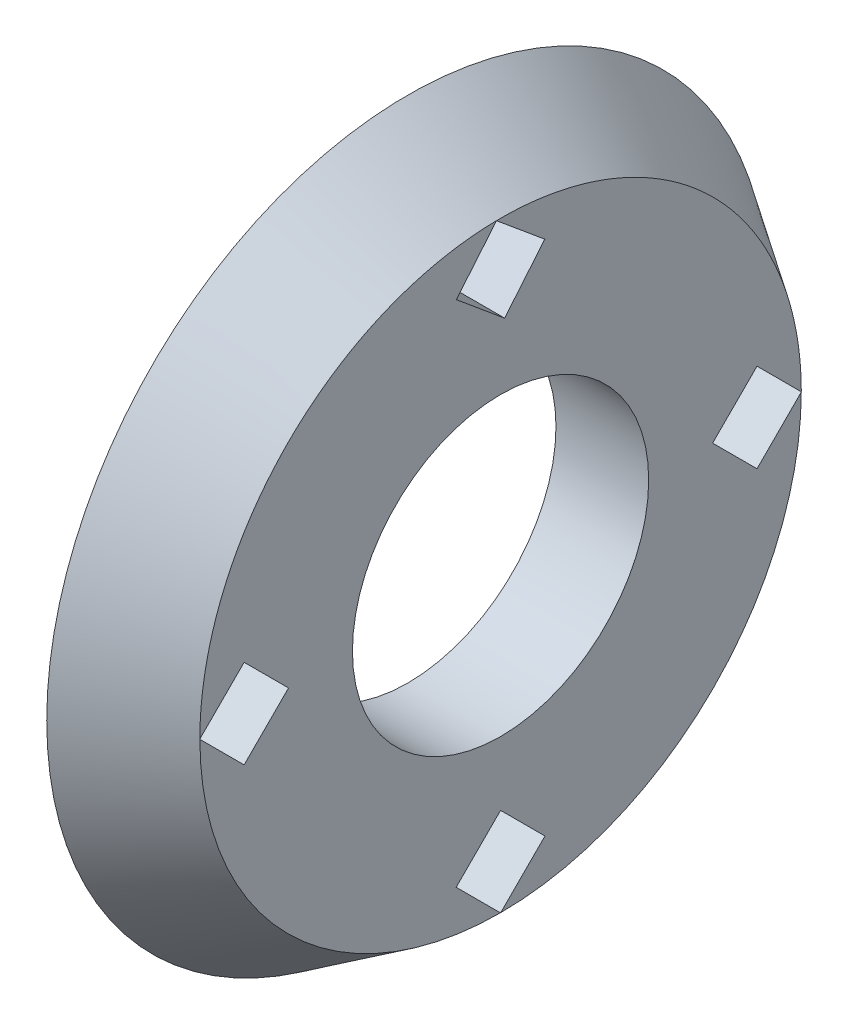
ISO-10303-21;
HEADER;
FILE_DESCRIPTION(('STEP AP214'),'2;1');
FILE_NAME('part.step','',(''),(''),'','','');
FILE_SCHEMA(('AUTOMOTIVE_DESIGN { 1 0 10303 214 1 1 1 1 }'));
ENDSEC;
DATA;
#1=APPLICATION_CONTEXT('core data for automotive mechanical design processes');
#2=APPLICATION_PROTOCOL_DEFINITION('international standard','automotive_design',2000,#1);
#3=PRODUCT_CONTEXT('',#1,'mechanical');
#4=PRODUCT('Part','Part','',(#3));
#5=PRODUCT_RELATED_PRODUCT_CATEGORY('part','',(#4));
#6=PRODUCT_DEFINITION_FORMATION('','',#4);
#7=PRODUCT_DEFINITION_CONTEXT('part definition',#1,'design');
#8=PRODUCT_DEFINITION('design','',#6,#7);
#9=PRODUCT_DEFINITION_SHAPE('','',#8);
#10=(LENGTH_UNIT() NAMED_UNIT(*) SI_UNIT(.MILLI.,.METRE.));
#11=(NAMED_UNIT(*) PLANE_ANGLE_UNIT() SI_UNIT($,.RADIAN.));
#12=(NAMED_UNIT(*) SI_UNIT($,.STERADIAN.) SOLID_ANGLE_UNIT());
#13=UNCERTAINTY_MEASURE_WITH_UNIT(LENGTH_MEASURE(1.E-05),#10,'distance_accuracy_value','');
#14=(GEOMETRIC_REPRESENTATION_CONTEXT(3) GLOBAL_UNCERTAINTY_ASSIGNED_CONTEXT((#13)) GLOBAL_UNIT_ASSIGNED_CONTEXT((#10,
#11,#12)) REPRESENTATION_CONTEXT('',''));
#15=CARTESIAN_POINT('',(0.,0.,0.));
#16=DIRECTION('',(0.,0.,1.));
#17=DIRECTION('',(1.,0.,0.));
#18=AXIS2_PLACEMENT_3D('',#15,#16,#17);
#19=CARTESIAN_POINT('',(-29.655516,7.1817785309434,-14.593824));
#20=DIRECTION('',(1.,0.,0.));
#21=DIRECTION('',(0.,0.,-1.));
#22=AXIS2_PLACEMENT_3D('',#19,#20,#21);
#23=PLANE('',#22);
#24=CARTESIAN_POINT('',(-29.655516,7.189216,0.));
#25=DIRECTION('',(1.,0.,0.));
#26=DIRECTION('',(0.,0.,-1.));
#27=AXIS2_PLACEMENT_3D('',#24,#25,#26);
#28=CIRCLE('',#27,7.189216);
#29=CARTESIAN_POINT('',(-29.655516,7.189216,-7.189216));
#30=VERTEX_POINT('',#29);
#31=EDGE_CURVE('E49',#30,#30,#28,.F.);
#32=ORIENTED_EDGE('',*,*,#31,.T.);
#33=EDGE_LOOP('',(#32));
#34=FACE_BOUND('',#33,.T.);
#35=CARTESIAN_POINT('',(-29.655516,7.189216,0.));
#36=DIRECTION('',(-1.,0.,0.));
#37=DIRECTION('',(0.,0.,1.));
#38=AXIS2_PLACEMENT_3D('',#35,#36,#37);
#39=CIRCLE('',#38,14.593824);
#40=CARTESIAN_POINT('',(-29.655516,7.1817785309434,-14.593824));
#41=VERTEX_POINT('',#40);
#42=CARTESIAN_POINT('',(-29.655516,-7.404608,-0.00743746905659945));
#43=VERTEX_POINT('',#42);
#44=EDGE_CURVE('E427',#41,#43,#39,.T.);
#45=ORIENTED_EDGE('',*,*,#44,.F.);
#46=DIRECTION('',(0.,0.707106781186548,-0.707106781186548));
#47=VECTOR('',#46,1.);
#48=CARTESIAN_POINT('',(-29.655516,-3.7060227345283,-3.7060227345283));
#49=LINE('',#48,#47);
#50=CARTESIAN_POINT('',(-29.655516,5.0339545309434,-12.446));
#51=VERTEX_POINT('',#50);
#52=EDGE_CURVE('E165',#51,#41,#49,.T.);
#53=ORIENTED_EDGE('',*,*,#52,.F.);
#54=DIRECTION('',(0.,-0.707106781186548,-0.707106781186547));
#55=VECTOR('',#54,1.);
#56=CARTESIAN_POINT('',(-29.655516,8.7399772654717,-8.7399772654717));
#57=LINE('',#56,#55);
#58=CARTESIAN_POINT('',(-29.655516,7.189216,-10.2907385309434));
#59=VERTEX_POINT('',#58);
#60=EDGE_CURVE('E170',#59,#51,#57,.T.);
#61=ORIENTED_EDGE('',*,*,#60,.F.);
#62=DIRECTION('',(0.,-0.707106781186548,0.707106781186547));
#63=VECTOR('',#62,1.);
#64=CARTESIAN_POINT('',(-29.655516,-1.5507612654717,-1.5507612654717));
#65=LINE('',#64,#63);
#66=CARTESIAN_POINT('',(-29.655516,9.34447746905659,-12.446));
#67=VERTEX_POINT('',#66);
#68=EDGE_CURVE('E135',#67,#59,#65,.T.);
#69=ORIENTED_EDGE('',*,*,#68,.F.);
#70=DIRECTION('',(0.,0.707106781186548,0.707106781186547));
#71=VECTOR('',#70,1.);
#72=CARTESIAN_POINT('',(-29.655516,10.8952387345283,-10.8952387345283));
#73=LINE('',#72,#71);
#74=CARTESIAN_POINT('',(-29.655516,7.19665346905659,-14.593824));
#75=VERTEX_POINT('',#74);
#76=EDGE_CURVE('E169',#75,#67,#73,.T.);
#77=ORIENTED_EDGE('',*,*,#76,.F.);
#78=CARTESIAN_POINT('',(-29.655516,7.1966534690566,14.593824));
#79=VERTEX_POINT('',#78);
#80=EDGE_CURVE('E420',#79,#75,#39,.T.);
#81=ORIENTED_EDGE('',*,*,#80,.F.);
#82=DIRECTION('',(0.,-0.707106781186548,0.707106781186548));
#83=VECTOR('',#82,1.);
#84=CARTESIAN_POINT('',(-29.655516,10.8952387345283,10.8952387345283));
#85=LINE('',#84,#83);
#86=CARTESIAN_POINT('',(-29.655516,9.3444774690566,12.446));
#87=VERTEX_POINT('',#86);
#88=EDGE_CURVE('E248',#87,#79,#85,.T.);
#89=ORIENTED_EDGE('',*,*,#88,.F.);
#90=DIRECTION('',(0.,0.707106781186548,0.707106781186548));
#91=VECTOR('',#90,1.);
#92=CARTESIAN_POINT('',(-29.655516,-1.5507612654717,1.5507612654717));
#93=LINE('',#92,#91);
#94=CARTESIAN_POINT('',(-29.655516,7.189216,10.2907385309434));
#95=VERTEX_POINT('',#94);
#96=EDGE_CURVE('E265',#95,#87,#93,.T.);
#97=ORIENTED_EDGE('',*,*,#96,.F.);
#98=DIRECTION('',(0.,0.707106781186547,-0.707106781186548));
#99=VECTOR('',#98,1.);
#100=CARTESIAN_POINT('',(-29.655516,8.7399772654717,8.73997726547169));
#101=LINE('',#100,#99);
#102=CARTESIAN_POINT('',(-29.655516,5.0339545309434,12.446));
#103=VERTEX_POINT('',#102);
#104=EDGE_CURVE('E233',#103,#95,#101,.T.);
#105=ORIENTED_EDGE('',*,*,#104,.F.);
#106=DIRECTION('',(0.,-0.707106781186548,-0.707106781186547));
#107=VECTOR('',#106,1.);
#108=CARTESIAN_POINT('',(-29.655516,-3.7060227345283,3.7060227345283));
#109=LINE('',#108,#107);
#110=CARTESIAN_POINT('',(-29.655516,7.18177663479341,14.59382210385));
#111=VERTEX_POINT('',#110);
#112=EDGE_CURVE('E229',#111,#103,#109,.T.);
#113=ORIENTED_EDGE('',*,*,#112,.F.);
#114=CARTESIAN_POINT('',(-29.655516,-7.404608,0.00743746905660031));
#115=VERTEX_POINT('',#114);
#116=EDGE_CURVE('E429',#115,#111,#39,.T.);
#117=ORIENTED_EDGE('',*,*,#116,.F.);
#118=DIRECTION('',(0.,-0.707106781186548,-0.707106781186547));
#119=VECTOR('',#118,1.);
#120=CARTESIAN_POINT('',(-29.655516,-3.7060227345283,3.7060227345283));
#121=LINE('',#120,#119);
#122=CARTESIAN_POINT('',(-29.655516,-5.256784,2.1552614690566));
#123=VERTEX_POINT('',#122);
#124=EDGE_CURVE('E186',#123,#115,#121,.T.);
#125=ORIENTED_EDGE('',*,*,#124,.F.);
#126=DIRECTION('',(0.,-0.707106781186548,0.707106781186548));
#127=VECTOR('',#126,1.);
#128=CARTESIAN_POINT('',(-29.655516,-1.5507612654717,-1.5507612654717));
#129=LINE('',#128,#127);
#130=CARTESIAN_POINT('',(-29.655516,-3.1015225309434,0.));
#131=VERTEX_POINT('',#130);
#132=EDGE_CURVE('E206',#131,#123,#129,.T.);
#133=ORIENTED_EDGE('',*,*,#132,.F.);
#134=DIRECTION('',(0.,0.707106781186548,0.707106781186548));
#135=VECTOR('',#134,1.);
#136=CARTESIAN_POINT('',(-29.655516,-1.5507612654717,1.5507612654717));
#137=LINE('',#136,#135);
#138=CARTESIAN_POINT('',(-29.655516,-5.256784,-2.1552614690566));
#139=VERTEX_POINT('',#138);
#140=EDGE_CURVE('E223',#139,#131,#137,.T.);
#141=ORIENTED_EDGE('',*,*,#140,.F.);
#142=DIRECTION('',(0.,0.707106781186548,-0.707106781186547));
#143=VECTOR('',#142,1.);
#144=CARTESIAN_POINT('',(-29.655516,-3.7060227345283,-3.7060227345283));
#145=LINE('',#144,#143);
#146=EDGE_CURVE('E191',#43,#139,#145,.T.);
#147=ORIENTED_EDGE('',*,*,#146,.F.);
#148=EDGE_LOOP('',(#45,#53,#61,#69,#77,#81,#89,#97,#105,#113,#117,#125,#133,#141,#147));
#149=FACE_BOUND('',#148,.T.);
#150=DIRECTION('',(0.,-0.768929183955108,0.639333958164379));
#151=VECTOR('',#150,1.);
#152=CARTESIAN_POINT('',(-29.655516,19.4377128758949,2.1461930285901));
#153=LINE('',#152,#151);
#154=CARTESIAN_POINT('',(-29.655516,21.7814090285901,0.197503124105072));
#155=VERTEX_POINT('',#154);
#156=CARTESIAN_POINT('',(-29.655516,19.4377128758949,2.1461930285901));
#157=VERTEX_POINT('',#156);
#158=EDGE_CURVE('E65',#155,#157,#153,.T.);
#159=ORIENTED_EDGE('',*,*,#158,.F.);
#160=DIRECTION('',(0.,0.639333958164379,0.768929183955108));
#161=VECTOR('',#160,1.);
#162=CARTESIAN_POINT('',(-29.655516,21.7814090285901,0.197503124105074));
#163=LINE('',#162,#161);
#164=CARTESIAN_POINT('',(-29.655516,19.8327191241051,-2.14619302859009));
#165=VERTEX_POINT('',#164);
#166=EDGE_CURVE('E56',#165,#155,#163,.T.);
#167=ORIENTED_EDGE('',*,*,#166,.F.);
#168=DIRECTION('',(0.,0.768929183955108,-0.639333958164379));
#169=VECTOR('',#168,1.);
#170=CARTESIAN_POINT('',(-29.655516,19.8327191241051,-2.14619302859009));
#171=LINE('',#170,#169);
#172=CARTESIAN_POINT('',(-29.655516,17.4890229714099,-0.197503124105066));
#173=VERTEX_POINT('',#172);
#174=EDGE_CURVE('E12',#173,#165,#171,.T.);
#175=ORIENTED_EDGE('',*,*,#174,.F.);
#176=DIRECTION('',(0.,-0.639333958164379,-0.768929183955108));
#177=VECTOR('',#176,1.);
#178=CARTESIAN_POINT('',(-29.655516,17.4890229714099,-0.197503124105067));
#179=LINE('',#178,#177);
#180=EDGE_CURVE('E287',#157,#173,#179,.T.);
#181=ORIENTED_EDGE('',*,*,#180,.F.);
#182=EDGE_LOOP('',(#159,#167,#175,#181));
#183=FACE_BOUND('',#182,.T.);
#184=ADVANCED_FACE('F45',(#34,#149,#183),#23,.T.);
#185=CARTESIAN_POINT('',(-23.559516,19.4377128758949,2.1461930285901));
#186=DIRECTION('',(0.,0.639333958164379,0.768929183955108));
#187=DIRECTION('',(0.,-0.768929183955108,0.639333958164379));
#188=AXIS2_PLACEMENT_3D('',#185,#186,#187);
#189=PLANE('',#188);
#190=ORIENTED_EDGE('',*,*,#158,.T.);
#191=DIRECTION('',(-1.,0.,0.));
#192=VECTOR('',#191,1.);
#193=CARTESIAN_POINT('',(-23.559516,19.4377128758949,2.1461930285901));
#194=LINE('',#193,#192);
#195=CARTESIAN_POINT('',(-34.155516,19.4377128758949,2.1461930285901));
#196=VERTEX_POINT('',#195);
#197=EDGE_CURVE('E280',#157,#196,#194,.T.);
#198=ORIENTED_EDGE('',*,*,#197,.T.);
#199=DIRECTION('',(0.,0.768929183955108,-0.639333958164379));
#200=VECTOR('',#199,1.);
#201=CARTESIAN_POINT('',(-34.155516,19.4377128758949,2.1461930285901));
#202=LINE('',#201,#200);
#203=CARTESIAN_POINT('',(-34.155516,21.7814090285901,0.197503124105074));
#204=VERTEX_POINT('',#203);
#205=EDGE_CURVE('E276',#196,#204,#202,.T.);
#206=ORIENTED_EDGE('',*,*,#205,.T.);
#207=DIRECTION('',(-1.,0.,0.));
#208=VECTOR('',#207,1.);
#209=CARTESIAN_POINT('',(-23.559516,21.7814090285901,0.197503124105074));
#210=LINE('',#209,#208);
#211=EDGE_CURVE('E283',#155,#204,#210,.T.);
#212=ORIENTED_EDGE('',*,*,#211,.F.);
#213=EDGE_LOOP('',(#190,#198,#206,#212));
#214=FACE_BOUND('',#213,.T.);
#215=ADVANCED_FACE('F395',(#214),#189,.F.);
#216=CARTESIAN_POINT('',(-23.559516,17.4890229714099,-0.197503124105067));
#217=DIRECTION('',(0.,-0.768929183955108,0.639333958164379));
#218=DIRECTION('',(0.,-0.639333958164379,-0.768929183955108));
#219=AXIS2_PLACEMENT_3D('',#216,#217,#218);
#220=PLANE('',#219);
#221=ORIENTED_EDGE('',*,*,#180,.T.);
#222=DIRECTION('',(-1.,0.,0.));
#223=VECTOR('',#222,1.);
#224=CARTESIAN_POINT('',(-23.559516,17.4890229714099,-0.197503124105067));
#225=LINE('',#224,#223);
#226=CARTESIAN_POINT('',(-34.155516,17.4890229714099,-0.197503124105067));
#227=VERTEX_POINT('',#226);
#228=EDGE_CURVE('E275',#173,#227,#225,.T.);
#229=ORIENTED_EDGE('',*,*,#228,.T.);
#230=DIRECTION('',(0.,0.639333958164379,0.768929183955108));
#231=VECTOR('',#230,1.);
#232=CARTESIAN_POINT('',(-34.155516,17.4890229714099,-0.197503124105067));
#233=LINE('',#232,#231);
#234=EDGE_CURVE('E291',#227,#196,#233,.T.);
#235=ORIENTED_EDGE('',*,*,#234,.T.);
#236=ORIENTED_EDGE('',*,*,#197,.F.);
#237=EDGE_LOOP('',(#221,#229,#235,#236));
#238=FACE_BOUND('',#237,.T.);
#239=ADVANCED_FACE('F401',(#238),#220,.F.);
#240=CARTESIAN_POINT('',(-23.559516,-1.5507612654717,1.5507612654717));
#241=DIRECTION('',(0.,0.707106781186547,-0.707106781186547));
#242=DIRECTION('',(0.,0.707106781186548,0.707106781186548));
#243=AXIS2_PLACEMENT_3D('',#240,#241,#242);
#244=PLANE('',#243);
#245=ORIENTED_EDGE('',*,*,#96,.T.);
#246=DIRECTION('',(-1.,0.,0.));
#247=VECTOR('',#246,1.);
#248=CARTESIAN_POINT('',(-23.559516,9.3444774690566,12.446));
#249=LINE('',#248,#247);
#250=CARTESIAN_POINT('',(-34.155516,9.3444774690566,12.446));
#251=VERTEX_POINT('',#250);
#252=EDGE_CURVE('E242',#87,#251,#249,.T.);
#253=ORIENTED_EDGE('',*,*,#252,.T.);
#254=DIRECTION('',(0.,-0.707106781186548,-0.707106781186548));
#255=VECTOR('',#254,1.);
#256=CARTESIAN_POINT('',(-34.155516,-1.5507612654717,1.5507612654717));
#257=LINE('',#256,#255);
#258=CARTESIAN_POINT('',(-34.155516,7.189216,10.2907385309434));
#259=VERTEX_POINT('',#258);
#260=EDGE_CURVE('E239',#251,#259,#257,.T.);
#261=ORIENTED_EDGE('',*,*,#260,.T.);
#262=DIRECTION('',(-1.,0.,0.));
#263=VECTOR('',#262,1.);
#264=CARTESIAN_POINT('',(-23.559516,7.189216,10.2907385309434));
#265=LINE('',#264,#263);
#266=EDGE_CURVE('E245',#95,#259,#265,.T.);
#267=ORIENTED_EDGE('',*,*,#266,.F.);
#268=EDGE_LOOP('',(#245,#253,#261,#267));
#269=FACE_BOUND('',#268,.T.);
#270=ADVANCED_FACE('F490',(#269),#244,.F.);
#271=CARTESIAN_POINT('',(-23.559516,10.8952387345283,10.8952387345283));
#272=DIRECTION('',(0.,0.707106781186547,0.707106781186547));
#273=DIRECTION('',(0.,-0.707106781186548,0.707106781186548));
#274=AXIS2_PLACEMENT_3D('',#271,#272,#273);
#275=PLANE('',#274);
#276=CARTESIAN_POINT('',(-29.655316,7.19678575120563,14.593691717851));
#277=CARTESIAN_POINT('',(-29.6573026233493,7.19549060620181,14.5949868628548));
#278=CARTESIAN_POINT('',(-29.6592893682319,7.19419555443276,14.5962819146238));
#279=CARTESIAN_POINT('',(-29.6632631010636,7.19160563736421,14.5988718316924));
#280=CARTESIAN_POINT('',(-29.6652500890127,7.19031077206471,14.6001666969919));
#281=CARTESIAN_POINT('',(-29.667237198495,7.18901599999997,14.6014614690566));
#282=B_SPLINE_CURVE_WITH_KNOTS('',3,(#276,#277,#278,#279,#280,#281),.UNSPECIFIED.,.F.,.F.,(4,2,
4),(0.,0.00810637160374341,0.0162127432074682),.UNSPECIFIED.);
#283=CARTESIAN_POINT('',(-29.6669302571096,7.189216,14.6012614690566));
#284=VERTEX_POINT('',#283);
#285=EDGE_CURVE('E318',#79,#284,#282,.T.);
#286=ORIENTED_EDGE('',*,*,#285,.T.);
#287=DIRECTION('',(-1.,0.,0.));
#288=VECTOR('',#287,1.);
#289=CARTESIAN_POINT('',(-23.559516,7.189216,14.6012614690566));
#290=LINE('',#289,#288);
#291=CARTESIAN_POINT('',(-34.155516,7.189216,14.6012614690566));
#292=VERTEX_POINT('',#291);
#293=EDGE_CURVE('E238',#284,#292,#290,.T.);
#294=ORIENTED_EDGE('',*,*,#293,.T.);
#295=DIRECTION('',(0.,0.707106781186548,-0.707106781186548));
#296=VECTOR('',#295,1.);
#297=CARTESIAN_POINT('',(-34.155516,10.8952387345283,10.8952387345283));
#298=LINE('',#297,#296);
#299=EDGE_CURVE('E252',#292,#251,#298,.T.);
#300=ORIENTED_EDGE('',*,*,#299,.T.);
#301=ORIENTED_EDGE('',*,*,#252,.F.);
#302=ORIENTED_EDGE('',*,*,#88,.T.);
#303=EDGE_LOOP('',(#286,#294,#300,#301,#302));
#304=FACE_BOUND('',#303,.T.);
#305=ADVANCED_FACE('F336',(#304),#275,.F.);
#306=CARTESIAN_POINT('',(-23.559516,8.7399772654717,8.73997726547169));
#307=DIRECTION('',(0.,-0.707106781186548,-0.707106781186547));
#308=DIRECTION('',(0.,0.707106781186547,-0.707106781186548));
#309=AXIS2_PLACEMENT_3D('',#306,#307,#308);
#310=PLANE('',#309);
#311=ORIENTED_EDGE('',*,*,#104,.T.);
#312=ORIENTED_EDGE('',*,*,#266,.T.);
#313=DIRECTION('',(0.,-0.707106781186547,0.707106781186548));
#314=VECTOR('',#313,1.);
#315=CARTESIAN_POINT('',(-34.155516,8.7399772654717,8.73997726547169));
#316=LINE('',#315,#314);
#317=CARTESIAN_POINT('',(-34.155516,5.0339545309434,12.446));
#318=VERTEX_POINT('',#317);
#319=EDGE_CURVE('E190',#259,#318,#316,.T.);
#320=ORIENTED_EDGE('',*,*,#319,.T.);
#321=DIRECTION('',(-1.,0.,0.));
#322=VECTOR('',#321,1.);
#323=CARTESIAN_POINT('',(-23.559516,5.0339545309434,12.446));
#324=LINE('',#323,#322);
#325=EDGE_CURVE('E234',#103,#318,#324,.T.);
#326=ORIENTED_EDGE('',*,*,#325,.F.);
#327=EDGE_LOOP('',(#311,#312,#320,#326));
#328=FACE_BOUND('',#327,.T.);
#329=ADVANCED_FACE('F339',(#328),#310,.F.);
#330=CARTESIAN_POINT('',(-23.559516,-1.5507612654717,1.5507612654717));
#331=DIRECTION('',(0.,0.707106781186547,-0.707106781186547));
#332=DIRECTION('',(0.,0.707106781186548,0.707106781186548));
#333=AXIS2_PLACEMENT_3D('',#330,#331,#332);
#334=PLANE('',#333);
#335=ORIENTED_EDGE('',*,*,#140,.T.);
#336=DIRECTION('',(-1.,0.,0.));
#337=VECTOR('',#336,1.);
#338=CARTESIAN_POINT('',(-23.559516,-3.1015225309434,0.));
#339=LINE('',#338,#337);
#340=CARTESIAN_POINT('',(-34.155516,-3.1015225309434,0.));
#341=VERTEX_POINT('',#340);
#342=EDGE_CURVE('E200',#131,#341,#339,.T.);
#343=ORIENTED_EDGE('',*,*,#342,.T.);
#344=DIRECTION('',(0.,-0.707106781186548,-0.707106781186548));
#345=VECTOR('',#344,1.);
#346=CARTESIAN_POINT('',(-34.155516,-1.5507612654717,1.5507612654717));
#347=LINE('',#346,#345);
#348=CARTESIAN_POINT('',(-34.155516,-5.256784,-2.1552614690566));
#349=VERTEX_POINT('',#348);
#350=EDGE_CURVE('E197',#341,#349,#347,.T.);
#351=ORIENTED_EDGE('',*,*,#350,.T.);
#352=DIRECTION('',(-1.,0.,0.));
#353=VECTOR('',#352,1.);
#354=CARTESIAN_POINT('',(-23.559516,-5.256784,-2.1552614690566));
#355=LINE('',#354,#353);
#356=EDGE_CURVE('E203',#139,#349,#355,.T.);
#357=ORIENTED_EDGE('',*,*,#356,.F.);
#358=EDGE_LOOP('',(#335,#343,#351,#357));
#359=FACE_BOUND('',#358,.T.);
#360=ADVANCED_FACE('F342',(#359),#334,.F.);
#361=CARTESIAN_POINT('',(-23.559516,-1.5507612654717,-1.5507612654717));
#362=DIRECTION('',(0.,0.707106781186547,0.707106781186547));
#363=DIRECTION('',(0.,-0.707106781186548,0.707106781186548));
#364=AXIS2_PLACEMENT_3D('',#361,#362,#363);
#365=PLANE('',#364);
#366=ORIENTED_EDGE('',*,*,#132,.T.);
#367=DIRECTION('',(-1.,0.,0.));
#368=VECTOR('',#367,1.);
#369=CARTESIAN_POINT('',(-23.559516,-5.256784,2.1552614690566));
#370=LINE('',#369,#368);
#371=CARTESIAN_POINT('',(-34.155516,-5.256784,2.1552614690566));
#372=VERTEX_POINT('',#371);
#373=EDGE_CURVE('E196',#123,#372,#370,.T.);
#374=ORIENTED_EDGE('',*,*,#373,.T.);
#375=DIRECTION('',(0.,0.707106781186548,-0.707106781186548));
#376=VECTOR('',#375,1.);
#377=CARTESIAN_POINT('',(-34.155516,-1.5507612654717,-1.5507612654717));
#378=LINE('',#377,#376);
#379=EDGE_CURVE('E210',#372,#341,#378,.T.);
#380=ORIENTED_EDGE('',*,*,#379,.T.);
#381=ORIENTED_EDGE('',*,*,#342,.F.);
#382=EDGE_LOOP('',(#366,#374,#380,#381));
#383=FACE_BOUND('',#382,.T.);
#384=ADVANCED_FACE('F346',(#383),#365,.F.);
#385=CARTESIAN_POINT('',(-23.559516,-3.7060227345283,-3.7060227345283));
#386=DIRECTION('',(0.,-0.707106781186547,-0.707106781186548));
#387=DIRECTION('',(0.,0.707106781186548,-0.707106781186547));
#388=AXIS2_PLACEMENT_3D('',#385,#386,#387);
#389=PLANE('',#388);
#390=CARTESIAN_POINT('',(-29.6672371984951,-7.4122454690566,0.00019999999999968));
#391=CARTESIAN_POINT('',(-29.6652500890127,-7.41095069699187,-0.00109477206472326));
#392=CARTESIAN_POINT('',(-29.6632631010636,-7.40965583169238,-0.00238963736421811));
#393=CARTESIAN_POINT('',(-29.6592893682319,-7.40706591462384,-0.00497955443275473));
#394=CARTESIAN_POINT('',(-29.6573026233493,-7.4057708628548,-0.0062746062017965));
#395=CARTESIAN_POINT('',(-29.655316,-7.40447571785099,-0.00756975120561018));
#396=B_SPLINE_CURVE_WITH_KNOTS('',3,(#390,#391,#392,#393,#394,#395),.UNSPECIFIED.,.F.,.F.,(4,2,
4),(0.,0.00810637160372379,0.016212743207467),.UNSPECIFIED.);
#397=CARTESIAN_POINT('',(-29.6669302571096,-7.4120454690566,0.));
#398=VERTEX_POINT('',#397);
#399=EDGE_CURVE('E366',#398,#43,#396,.T.);
#400=ORIENTED_EDGE('',*,*,#399,.T.);
#401=ORIENTED_EDGE('',*,*,#146,.T.);
#402=ORIENTED_EDGE('',*,*,#356,.T.);
#403=DIRECTION('',(0.,-0.707106781186548,0.707106781186547));
#404=VECTOR('',#403,1.);
#405=CARTESIAN_POINT('',(-34.155516,-3.7060227345283,-3.7060227345283));
#406=LINE('',#405,#404);
#407=CARTESIAN_POINT('',(-34.155516,-7.41204546905659,0.));
#408=VERTEX_POINT('',#407);
#409=EDGE_CURVE('E164',#349,#408,#406,.T.);
#410=ORIENTED_EDGE('',*,*,#409,.T.);
#411=DIRECTION('',(-1.,0.,0.));
#412=VECTOR('',#411,1.);
#413=CARTESIAN_POINT('',(-23.559516,-7.4120454690566,0.));
#414=LINE('',#413,#412);
#415=EDGE_CURVE('E192',#398,#408,#414,.T.);
#416=ORIENTED_EDGE('',*,*,#415,.F.);
#417=EDGE_LOOP('',(#400,#401,#402,#410,#416));
#418=FACE_BOUND('',#417,.T.);
#419=ADVANCED_FACE('F350',(#418),#389,.F.);
#420=CARTESIAN_POINT('',(-29.655516,7.189216,0.));
#421=DIRECTION('',(-1.,0.,0.));
#422=DIRECTION('',(0.,0.,1.));
#423=AXIS2_PLACEMENT_3D('',#420,#421,#422);
#424=CONICAL_SURFACE('',#423,14.593824,0.57749543490412);
#425=CARTESIAN_POINT('',(-29.655316,7.18164624879437,-14.593691717851));
#426=CARTESIAN_POINT('',(-29.6573026233493,7.18294139379819,-14.5949868628548));
#427=CARTESIAN_POINT('',(-29.6592893682319,7.18423644556723,-14.5962819146238));
#428=CARTESIAN_POINT('',(-29.6632631010636,7.18682636263579,-14.5988718316924));
#429=CARTESIAN_POINT('',(-29.6652500890127,7.18812122793529,-14.6001666969919));
#430=CARTESIAN_POINT('',(-29.667237198495,7.18941600000002,-14.6014614690566));
#431=B_SPLINE_CURVE_WITH_KNOTS('',3,(#425,#426,#427,#428,#429,#430),.UNSPECIFIED.,.F.,.F.,(4,2,
4),(0.,0.00810637160374133,0.0162127432074635),.UNSPECIFIED.);
#432=CARTESIAN_POINT('',(-29.6669302571096,7.189216,-14.6012614690566));
#433=VERTEX_POINT('',#432);
#434=EDGE_CURVE('E383',#41,#433,#431,.T.);
#435=ORIENTED_EDGE('',*,*,#434,.F.);
#436=ORIENTED_EDGE('',*,*,#44,.T.);
#437=ORIENTED_EDGE('',*,*,#399,.F.);
#438=CARTESIAN_POINT('',(-29.655316,-7.40447571785096,0.00756975120563343));
#439=CARTESIAN_POINT('',(-29.6573026233493,-7.40577086285478,0.00627460620181174));
#440=CARTESIAN_POINT('',(-29.6592893682319,-7.40706591462383,0.00497955443276193));
#441=CARTESIAN_POINT('',(-29.6632631010636,-7.40965583169239,0.00238963736420923));
#442=CARTESIAN_POINT('',(-29.6652500890127,-7.41095069699189,0.00109477206470634));
#443=CARTESIAN_POINT('',(-29.667237198495,-7.41224546905662,-0.000200000000024669));
#444=B_SPLINE_CURVE_WITH_KNOTS('',3,(#438,#439,#440,#441,#442,#443),.UNSPECIFIED.,.F.,.F.,(4,2,
4),(0.,0.0081063716037434,0.016212743207467),.UNSPECIFIED.);
#445=EDGE_CURVE('E358',#115,#398,#444,.T.);
#446=ORIENTED_EDGE('',*,*,#445,.F.);
#447=ORIENTED_EDGE('',*,*,#116,.T.);
#448=CARTESIAN_POINT('',(-29.6672371984951,7.189416,14.6014614690566));
#449=CARTESIAN_POINT('',(-29.6652500890127,7.18812122793527,14.6001666969919));
#450=CARTESIAN_POINT('',(-29.6632631010636,7.18682636263578,14.5988718316924));
#451=CARTESIAN_POINT('',(-29.6592893682319,7.18423644556724,14.5962819146238));
#452=CARTESIAN_POINT('',(-29.6573026233493,7.1829413937982,14.5949868628548));
#453=CARTESIAN_POINT('',(-29.655316,7.18164624879439,14.593691717851));
#454=B_SPLINE_CURVE_WITH_KNOTS('',3,(#448,#449,#450,#451,#452,#453),.UNSPECIFIED.,.F.,.F.,(4,2,
4),(0.,0.00810637160372446,0.016212743207468),.UNSPECIFIED.);
#455=EDGE_CURVE('E185',#284,#111,#454,.T.);
#456=ORIENTED_EDGE('',*,*,#455,.F.);
#457=ORIENTED_EDGE('',*,*,#285,.F.);
#458=ORIENTED_EDGE('',*,*,#80,.T.);
#459=CARTESIAN_POINT('',(-29.6672371984951,7.189016,-14.6014614690566));
#460=CARTESIAN_POINT('',(-29.6652500890127,7.19031077206472,-14.6001666969919));
#461=CARTESIAN_POINT('',(-29.6632631010636,7.19160563736421,-14.5988718316924));
#462=CARTESIAN_POINT('',(-29.6592893682319,7.19419555443275,-14.5962819146238));
#463=CARTESIAN_POINT('',(-29.6573026233493,7.19549060620179,-14.5949868628548));
#464=CARTESIAN_POINT('',(-29.655316,7.19678575120561,-14.593691717851));
#465=B_SPLINE_CURVE_WITH_KNOTS('',3,(#459,#460,#461,#462,#463,#464),.UNSPECIFIED.,.F.,.F.,(4,2,
4),(0.,0.00810637160372066,0.0162127432074625),.UNSPECIFIED.);
#466=EDGE_CURVE('E374',#433,#75,#465,.T.);
#467=ORIENTED_EDGE('',*,*,#466,.F.);
#468=EDGE_LOOP('',(#435,#436,#437,#446,#447,#456,#457,#458,#467));
#469=FACE_BOUND('',#468,.T.);
#470=CARTESIAN_POINT('',(-34.155516,7.189216,0.));
#471=DIRECTION('',(-1.,0.,0.));
#472=DIRECTION('',(0.,0.,1.));
#473=AXIS2_PLACEMENT_3D('',#470,#471,#472);
#474=CIRCLE('',#473,17.526);
#475=CARTESIAN_POINT('',(-34.155516,7.189216,17.526));
#476=VERTEX_POINT('',#475);
#477=EDGE_CURVE('E417',#476,#476,#474,.T.);
#478=ORIENTED_EDGE('',*,*,#477,.F.);
#479=EDGE_LOOP('',(#478));
#480=FACE_BOUND('',#479,.T.);
#481=ADVANCED_FACE('F325',(#469,#480),#424,.T.);
#482=CARTESIAN_POINT('',(-23.559516,10.8952387345283,-10.8952387345283));
#483=DIRECTION('',(0.,0.707106781186547,-0.707106781186548));
#484=DIRECTION('',(0.,0.707106781186548,0.707106781186547));
#485=AXIS2_PLACEMENT_3D('',#482,#483,#484);
#486=PLANE('',#485);
#487=ORIENTED_EDGE('',*,*,#466,.T.);
#488=ORIENTED_EDGE('',*,*,#76,.T.);
#489=DIRECTION('',(-1.,0.,0.));
#490=VECTOR('',#489,1.);
#491=CARTESIAN_POINT('',(-23.559516,9.34447746905659,-12.446));
#492=LINE('',#491,#490);
#493=CARTESIAN_POINT('',(-34.155516,9.34447746905659,-12.446));
#494=VERTEX_POINT('',#493);
#495=EDGE_CURVE('E121',#67,#494,#492,.T.);
#496=ORIENTED_EDGE('',*,*,#495,.T.);
#497=DIRECTION('',(0.,-0.707106781186548,-0.707106781186547));
#498=VECTOR('',#497,1.);
#499=CARTESIAN_POINT('',(-34.155516,10.8952387345283,-10.8952387345283));
#500=LINE('',#499,#498);
#501=CARTESIAN_POINT('',(-34.155516,7.189216,-14.6012614690566));
#502=VERTEX_POINT('',#501);
#503=EDGE_CURVE('E154',#494,#502,#500,.T.);
#504=ORIENTED_EDGE('',*,*,#503,.T.);
#505=DIRECTION('',(-1.,0.,0.));
#506=VECTOR('',#505,1.);
#507=CARTESIAN_POINT('',(-23.559516,7.189216,-14.6012614690566));
#508=LINE('',#507,#506);
#509=EDGE_CURVE('E173',#433,#502,#508,.T.);
#510=ORIENTED_EDGE('',*,*,#509,.F.);
#511=EDGE_LOOP('',(#487,#488,#496,#504,#510));
#512=FACE_BOUND('',#511,.T.);
#513=ADVANCED_FACE('F389',(#512),#486,.F.);
#514=CARTESIAN_POINT('',(-23.559516,-1.5507612654717,-1.5507612654717));
#515=DIRECTION('',(0.,0.707106781186547,0.707106781186548));
#516=DIRECTION('',(0.,-0.707106781186548,0.707106781186547));
#517=AXIS2_PLACEMENT_3D('',#514,#515,#516);
#518=PLANE('',#517);
#519=ORIENTED_EDGE('',*,*,#68,.T.);
#520=DIRECTION('',(-1.,0.,0.));
#521=VECTOR('',#520,1.);
#522=CARTESIAN_POINT('',(-23.559516,7.189216,-10.2907385309434));
#523=LINE('',#522,#521);
#524=CARTESIAN_POINT('',(-34.155516,7.189216,-10.2907385309434));
#525=VERTEX_POINT('',#524);
#526=EDGE_CURVE('E127',#59,#525,#523,.T.);
#527=ORIENTED_EDGE('',*,*,#526,.T.);
#528=DIRECTION('',(0.,0.707106781186548,-0.707106781186547));
#529=VECTOR('',#528,1.);
#530=CARTESIAN_POINT('',(-34.155516,-1.5507612654717,-1.5507612654717));
#531=LINE('',#530,#529);
#532=EDGE_CURVE('E131',#525,#494,#531,.T.);
#533=ORIENTED_EDGE('',*,*,#532,.T.);
#534=ORIENTED_EDGE('',*,*,#495,.F.);
#535=EDGE_LOOP('',(#519,#527,#533,#534));
#536=FACE_BOUND('',#535,.T.);
#537=ADVANCED_FACE('F129',(#536),#518,.F.);
#538=CARTESIAN_POINT('',(-34.155516,7.189216,0.));
#539=DIRECTION('',(-1.,0.,0.));
#540=DIRECTION('',(0.,0.,1.));
#541=AXIS2_PLACEMENT_3D('',#538,#539,#540);
#542=PLANE('',#541);
#543=DIRECTION('',(0.,-0.707106781186548,0.707106781186548));
#544=VECTOR('',#543,1.);
#545=CARTESIAN_POINT('',(-34.155516,-3.7060227345283,-3.7060227345283));
#546=LINE('',#545,#544);
#547=CARTESIAN_POINT('',(-34.155516,5.0339545309434,-12.446));
#548=VERTEX_POINT('',#547);
#549=EDGE_CURVE('E150',#502,#548,#546,.T.);
#550=ORIENTED_EDGE('',*,*,#549,.F.);
#551=ORIENTED_EDGE('',*,*,#503,.F.);
#552=ORIENTED_EDGE('',*,*,#532,.F.);
#553=DIRECTION('',(0.,0.707106781186548,0.707106781186547));
#554=VECTOR('',#553,1.);
#555=CARTESIAN_POINT('',(-34.155516,8.7399772654717,-8.7399772654717));
#556=LINE('',#555,#554);
#557=EDGE_CURVE('E143',#548,#525,#556,.T.);
#558=ORIENTED_EDGE('',*,*,#557,.F.);
#559=EDGE_LOOP('',(#550,#551,#552,#558));
#560=FACE_BOUND('',#559,.T.);
#561=ORIENTED_EDGE('',*,*,#409,.F.);
#562=ORIENTED_EDGE('',*,*,#350,.F.);
#563=ORIENTED_EDGE('',*,*,#379,.F.);
#564=DIRECTION('',(0.,0.707106781186548,0.707106781186547));
#565=VECTOR('',#564,1.);
#566=CARTESIAN_POINT('',(-34.155516,-3.7060227345283,3.7060227345283));
#567=LINE('',#566,#565);
#568=EDGE_CURVE('E214',#408,#372,#567,.T.);
#569=ORIENTED_EDGE('',*,*,#568,.F.);
#570=EDGE_LOOP('',(#561,#562,#563,#569));
#571=FACE_BOUND('',#570,.T.);
#572=ORIENTED_EDGE('',*,*,#319,.F.);
#573=ORIENTED_EDGE('',*,*,#260,.F.);
#574=ORIENTED_EDGE('',*,*,#299,.F.);
#575=DIRECTION('',(0.,0.707106781186548,0.707106781186547));
#576=VECTOR('',#575,1.);
#577=CARTESIAN_POINT('',(-34.155516,-3.7060227345283,3.7060227345283));
#578=LINE('',#577,#576);
#579=EDGE_CURVE('E256',#318,#292,#578,.T.);
#580=ORIENTED_EDGE('',*,*,#579,.F.);
#581=EDGE_LOOP('',(#572,#573,#574,#580));
#582=FACE_BOUND('',#581,.T.);
#583=DIRECTION('',(0.,-0.639333958164379,-0.768929183955108));
#584=VECTOR('',#583,1.);
#585=CARTESIAN_POINT('',(-34.155516,21.7814090285901,0.197503124105074));
#586=LINE('',#585,#584);
#587=CARTESIAN_POINT('',(-34.155516,19.8327191241051,-2.14619302859009));
#588=VERTEX_POINT('',#587);
#589=EDGE_CURVE('E232',#204,#588,#586,.T.);
#590=ORIENTED_EDGE('',*,*,#589,.F.);
#591=ORIENTED_EDGE('',*,*,#205,.F.);
#592=ORIENTED_EDGE('',*,*,#234,.F.);
#593=DIRECTION('',(0.,-0.768929183955108,0.639333958164379));
#594=VECTOR('',#593,1.);
#595=CARTESIAN_POINT('',(-34.155516,19.8327191241051,-2.14619302859009));
#596=LINE('',#595,#594);
#597=EDGE_CURVE('E295',#588,#227,#596,.T.);
#598=ORIENTED_EDGE('',*,*,#597,.F.);
#599=EDGE_LOOP('',(#590,#591,#592,#598));
#600=FACE_BOUND('',#599,.T.);
#601=CARTESIAN_POINT('',(-34.155516,7.189216,0.));
#602=DIRECTION('',(-1.,0.,0.));
#603=DIRECTION('',(0.,0.,1.));
#604=AXIS2_PLACEMENT_3D('',#601,#602,#603);
#605=CIRCLE('',#604,7.189216);
#606=CARTESIAN_POINT('',(-34.155516,7.189216,7.189216));
#607=VERTEX_POINT('',#606);
#608=EDGE_CURVE('E414',#607,#607,#605,.T.);
#609=ORIENTED_EDGE('',*,*,#608,.F.);
#610=EDGE_LOOP('',(#609));
#611=FACE_BOUND('',#610,.T.);
#612=ORIENTED_EDGE('',*,*,#477,.T.);
#613=EDGE_LOOP('',(#612));
#614=FACE_BOUND('',#613,.T.);
#615=ADVANCED_FACE('F152',(#560,#571,#582,#600,#611,#614),#542,.T.);
#616=CARTESIAN_POINT('',(-23.559516,-3.7060227345283,-3.7060227345283));
#617=DIRECTION('',(0.,-0.707106781186547,-0.707106781186547));
#618=DIRECTION('',(0.,0.707106781186548,-0.707106781186548));
#619=AXIS2_PLACEMENT_3D('',#616,#617,#618);
#620=PLANE('',#619);
#621=ORIENTED_EDGE('',*,*,#434,.T.);
#622=ORIENTED_EDGE('',*,*,#509,.T.);
#623=ORIENTED_EDGE('',*,*,#549,.T.);
#624=DIRECTION('',(-1.,0.,0.));
#625=VECTOR('',#624,1.);
#626=CARTESIAN_POINT('',(-23.559516,5.0339545309434,-12.446));
#627=LINE('',#626,#625);
#628=EDGE_CURVE('E139',#51,#548,#627,.T.);
#629=ORIENTED_EDGE('',*,*,#628,.F.);
#630=ORIENTED_EDGE('',*,*,#52,.T.);
#631=EDGE_LOOP('',(#621,#622,#623,#629,#630));
#632=FACE_BOUND('',#631,.T.);
#633=ADVANCED_FACE('F442',(#632),#620,.F.);
#634=CARTESIAN_POINT('',(-23.559516,8.7399772654717,-8.7399772654717));
#635=DIRECTION('',(0.,-0.707106781186547,0.707106781186548));
#636=DIRECTION('',(0.,-0.707106781186548,-0.707106781186547));
#637=AXIS2_PLACEMENT_3D('',#634,#635,#636);
#638=PLANE('',#637);
#639=ORIENTED_EDGE('',*,*,#60,.T.);
#640=ORIENTED_EDGE('',*,*,#628,.T.);
#641=ORIENTED_EDGE('',*,*,#557,.T.);
#642=ORIENTED_EDGE('',*,*,#526,.F.);
#643=EDGE_LOOP('',(#639,#640,#641,#642));
#644=FACE_BOUND('',#643,.T.);
#645=ADVANCED_FACE('F144',(#644),#638,.F.);
#646=CARTESIAN_POINT('',(-23.559516,-3.7060227345283,3.7060227345283));
#647=DIRECTION('',(0.,-0.707106781186547,0.707106781186548));
#648=DIRECTION('',(0.,-0.707106781186548,-0.707106781186547));
#649=AXIS2_PLACEMENT_3D('',#646,#647,#648);
#650=PLANE('',#649);
#651=ORIENTED_EDGE('',*,*,#445,.T.);
#652=ORIENTED_EDGE('',*,*,#415,.T.);
#653=ORIENTED_EDGE('',*,*,#568,.T.);
#654=ORIENTED_EDGE('',*,*,#373,.F.);
#655=ORIENTED_EDGE('',*,*,#124,.T.);
#656=EDGE_LOOP('',(#651,#652,#653,#654,#655));
#657=FACE_BOUND('',#656,.T.);
#658=ADVANCED_FACE('F334',(#657),#650,.F.);
#659=CARTESIAN_POINT('',(-23.559516,-3.7060227345283,3.7060227345283));
#660=DIRECTION('',(0.,-0.707106781186547,0.707106781186548));
#661=DIRECTION('',(0.,-0.707106781186548,-0.707106781186547));
#662=AXIS2_PLACEMENT_3D('',#659,#660,#661);
#663=PLANE('',#662);
#664=ORIENTED_EDGE('',*,*,#455,.T.);
#665=ORIENTED_EDGE('',*,*,#112,.T.);
#666=ORIENTED_EDGE('',*,*,#325,.T.);
#667=ORIENTED_EDGE('',*,*,#579,.T.);
#668=ORIENTED_EDGE('',*,*,#293,.F.);
#669=EDGE_LOOP('',(#664,#665,#666,#667,#668));
#670=FACE_BOUND('',#669,.T.);
#671=ADVANCED_FACE('F329',(#670),#663,.F.);
#672=CARTESIAN_POINT('',(-23.559516,21.7814090285901,0.197503124105074));
#673=DIRECTION('',(0.,0.768929183955108,-0.639333958164379));
#674=DIRECTION('',(0.,0.639333958164379,0.768929183955108));
#675=AXIS2_PLACEMENT_3D('',#672,#673,#674);
#676=PLANE('',#675);
#677=ORIENTED_EDGE('',*,*,#166,.T.);
#678=ORIENTED_EDGE('',*,*,#211,.T.);
#679=ORIENTED_EDGE('',*,*,#589,.T.);
#680=DIRECTION('',(-1.,0.,0.));
#681=VECTOR('',#680,1.);
#682=CARTESIAN_POINT('',(-23.559516,19.8327191241051,-2.14619302859009));
#683=LINE('',#682,#681);
#684=EDGE_CURVE('E271',#165,#588,#683,.T.);
#685=ORIENTED_EDGE('',*,*,#684,.F.);
#686=EDGE_LOOP('',(#677,#678,#679,#685));
#687=FACE_BOUND('',#686,.T.);
#688=ADVANCED_FACE('F333',(#687),#676,.F.);
#689=CARTESIAN_POINT('',(-23.559516,19.8327191241051,-2.14619302859009));
#690=DIRECTION('',(0.,-0.639333958164379,-0.768929183955108));
#691=DIRECTION('',(0.,0.768929183955108,-0.639333958164379));
#692=AXIS2_PLACEMENT_3D('',#689,#690,#691);
#693=PLANE('',#692);
#694=ORIENTED_EDGE('',*,*,#174,.T.);
#695=ORIENTED_EDGE('',*,*,#684,.T.);
#696=ORIENTED_EDGE('',*,*,#597,.T.);
#697=ORIENTED_EDGE('',*,*,#228,.F.);
#698=EDGE_LOOP('',(#694,#695,#696,#697));
#699=FACE_BOUND('',#698,.T.);
#700=ADVANCED_FACE('F405',(#699),#693,.F.);
#701=CARTESIAN_POINT('',(-29.655516,7.189216,0.));
#702=DIRECTION('',(1.,0.,0.));
#703=DIRECTION('',(0.,0.,-1.));
#704=AXIS2_PLACEMENT_3D('',#701,#702,#703);
#705=CYLINDRICAL_SURFACE('',#704,7.189216);
#706=ORIENTED_EDGE('',*,*,#608,.T.);
#707=EDGE_LOOP('',(#706));
#708=FACE_BOUND('',#707,.T.);
#709=ORIENTED_EDGE('',*,*,#31,.F.);
#710=EDGE_LOOP('',(#709));
#711=FACE_BOUND('',#710,.T.);
#712=ADVANCED_FACE('F47',(#708,#711),#705,.F.);
#713=CLOSED_SHELL('',(#184,#215,#239,#270,#305,#329,#360,#384,#419,#481,#513,#537,#615,#633,
#645,#658,#671,#688,#700,#712));
#714=MANIFOLD_SOLID_BREP('B2',#713);
#715=ADVANCED_BREP_SHAPE_REPRESENTATION('',(#18,#714),#14);
#716=SHAPE_DEFINITION_REPRESENTATION(#9,#715);
ENDSEC;
END-ISO-10303-21;
